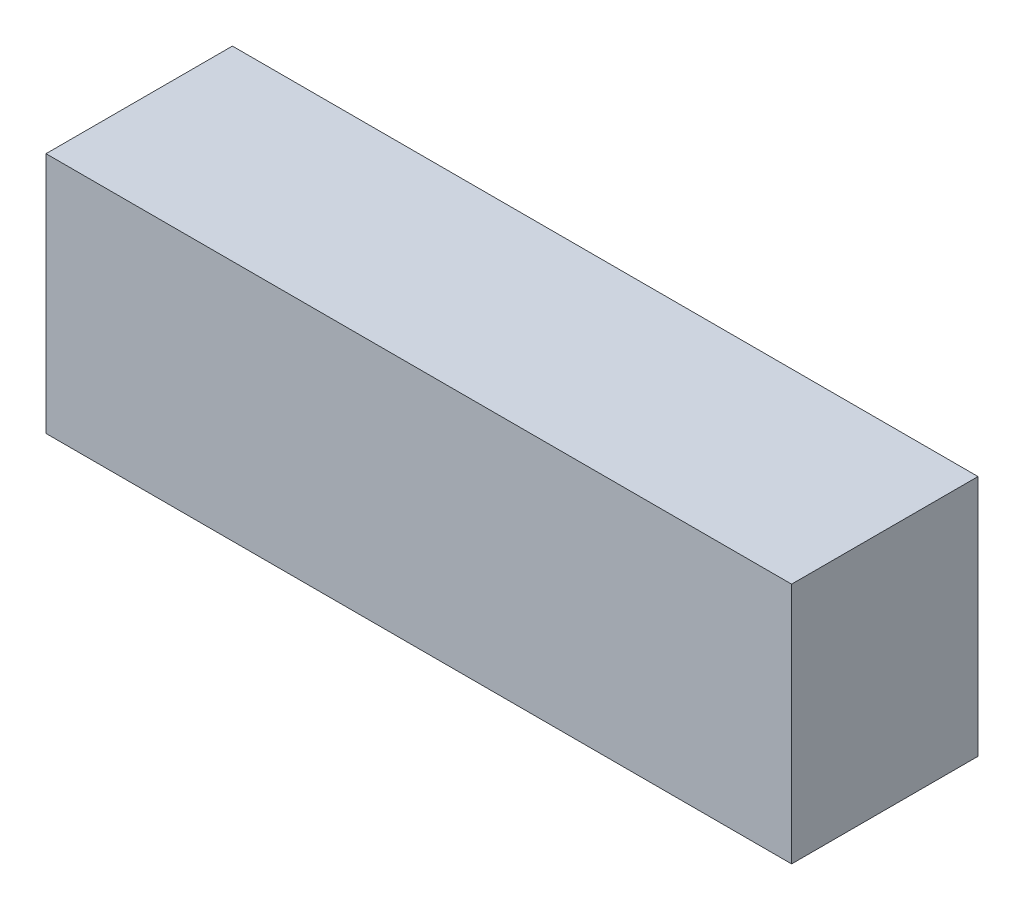
ISO-10303-21;
HEADER;
FILE_DESCRIPTION(('STEP AP214'),'2;1');
FILE_NAME('part.step','',(''),(''),'','','');
FILE_SCHEMA(('AUTOMOTIVE_DESIGN { 1 0 10303 214 1 1 1 1 }'));
ENDSEC;
DATA;
#1=APPLICATION_CONTEXT('core data for automotive mechanical design processes');
#2=APPLICATION_PROTOCOL_DEFINITION('international standard','automotive_design',2000,#1);
#3=PRODUCT_CONTEXT('',#1,'mechanical');
#4=PRODUCT('Part','Part','',(#3));
#5=PRODUCT_RELATED_PRODUCT_CATEGORY('part','',(#4));
#6=PRODUCT_DEFINITION_FORMATION('','',#4);
#7=PRODUCT_DEFINITION_CONTEXT('part definition',#1,'design');
#8=PRODUCT_DEFINITION('design','',#6,#7);
#9=PRODUCT_DEFINITION_SHAPE('','',#8);
#10=(LENGTH_UNIT() NAMED_UNIT(*) SI_UNIT(.MILLI.,.METRE.));
#11=(NAMED_UNIT(*) PLANE_ANGLE_UNIT() SI_UNIT($,.RADIAN.));
#12=(NAMED_UNIT(*) SI_UNIT($,.STERADIAN.) SOLID_ANGLE_UNIT());
#13=UNCERTAINTY_MEASURE_WITH_UNIT(LENGTH_MEASURE(1.E-05),#10,'distance_accuracy_value','');
#14=(GEOMETRIC_REPRESENTATION_CONTEXT(3) GLOBAL_UNCERTAINTY_ASSIGNED_CONTEXT((#13)) GLOBAL_UNIT_ASSIGNED_CONTEXT((#10,
#11,#12)) REPRESENTATION_CONTEXT('',''));
#15=CARTESIAN_POINT('',(0.,0.,0.));
#16=DIRECTION('',(0.,0.,1.));
#17=DIRECTION('',(1.,0.,0.));
#18=AXIS2_PLACEMENT_3D('',#15,#16,#17);
#19=CARTESIAN_POINT('',(0.,0.,-10.));
#20=DIRECTION('',(-1.,0.,0.));
#21=DIRECTION('',(0.,0.,1.));
#22=AXIS2_PLACEMENT_3D('',#19,#20,#21);
#23=PLANE('',#22);
#24=DIRECTION('',(0.,-1.,0.));
#25=VECTOR('',#24,1.);
#26=CARTESIAN_POINT('',(0.,0.,0.));
#27=LINE('',#26,#25);
#28=CARTESIAN_POINT('',(0.,13.,0.));
#29=VERTEX_POINT('',#28);
#30=CARTESIAN_POINT('',(0.,0.,0.));
#31=VERTEX_POINT('',#30);
#32=EDGE_CURVE('E107',#29,#31,#27,.T.);
#33=ORIENTED_EDGE('',*,*,#32,.F.);
#34=DIRECTION('',(0.,0.,1.));
#35=VECTOR('',#34,1.);
#36=CARTESIAN_POINT('',(0.,13.,-10.));
#37=LINE('',#36,#35);
#38=CARTESIAN_POINT('',(0.,13.,-10.));
#39=VERTEX_POINT('',#38);
#40=EDGE_CURVE('E11',#39,#29,#37,.T.);
#41=ORIENTED_EDGE('',*,*,#40,.F.);
#42=DIRECTION('',(0.,-1.,0.));
#43=VECTOR('',#42,1.);
#44=CARTESIAN_POINT('',(0.,0.,-10.));
#45=LINE('',#44,#43);
#46=CARTESIAN_POINT('',(0.,0.,-10.));
#47=VERTEX_POINT('',#46);
#48=EDGE_CURVE('E102',#39,#47,#45,.T.);
#49=ORIENTED_EDGE('',*,*,#48,.T.);
#50=DIRECTION('',(0.,0.,1.));
#51=VECTOR('',#50,1.);
#52=CARTESIAN_POINT('',(0.,0.,-10.));
#53=LINE('',#52,#51);
#54=EDGE_CURVE('E46',#47,#31,#53,.T.);
#55=ORIENTED_EDGE('',*,*,#54,.T.);
#56=EDGE_LOOP('',(#33,#41,#49,#55));
#57=FACE_BOUND('',#56,.T.);
#58=ADVANCED_FACE('F43',(#57),#23,.T.);
#59=CARTESIAN_POINT('',(0.,13.,-10.));
#60=DIRECTION('',(0.,1.,0.));
#61=DIRECTION('',(0.,0.,1.));
#62=AXIS2_PLACEMENT_3D('',#59,#60,#61);
#63=PLANE('',#62);
#64=DIRECTION('',(-1.,0.,0.));
#65=VECTOR('',#64,1.);
#66=CARTESIAN_POINT('',(0.,13.,0.));
#67=LINE('',#66,#65);
#68=CARTESIAN_POINT('',(40.,13.,0.));
#69=VERTEX_POINT('',#68);
#70=EDGE_CURVE('E104',#69,#29,#67,.T.);
#71=ORIENTED_EDGE('',*,*,#70,.F.);
#72=DIRECTION('',(0.,0.,1.));
#73=VECTOR('',#72,1.);
#74=CARTESIAN_POINT('',(40.,13.,-10.));
#75=LINE('',#74,#73);
#76=CARTESIAN_POINT('',(40.,13.,-10.));
#77=VERTEX_POINT('',#76);
#78=EDGE_CURVE('E55',#77,#69,#75,.T.);
#79=ORIENTED_EDGE('',*,*,#78,.F.);
#80=DIRECTION('',(-1.,0.,0.));
#81=VECTOR('',#80,1.);
#82=CARTESIAN_POINT('',(0.,13.,-10.));
#83=LINE('',#82,#81);
#84=EDGE_CURVE('E97',#77,#39,#83,.T.);
#85=ORIENTED_EDGE('',*,*,#84,.T.);
#86=ORIENTED_EDGE('',*,*,#40,.T.);
#87=EDGE_LOOP('',(#71,#79,#85,#86));
#88=FACE_BOUND('',#87,.T.);
#89=ADVANCED_FACE('F117',(#88),#63,.T.);
#90=CARTESIAN_POINT('',(40.,0.,-10.));
#91=DIRECTION('',(1.,0.,0.));
#92=DIRECTION('',(0.,0.,-1.));
#93=AXIS2_PLACEMENT_3D('',#90,#91,#92);
#94=PLANE('',#93);
#95=DIRECTION('',(0.,1.,0.));
#96=VECTOR('',#95,1.);
#97=CARTESIAN_POINT('',(40.,0.,0.));
#98=LINE('',#97,#96);
#99=CARTESIAN_POINT('',(40.,0.,0.));
#100=VERTEX_POINT('',#99);
#101=EDGE_CURVE('E93',#100,#69,#98,.T.);
#102=ORIENTED_EDGE('',*,*,#101,.F.);
#103=DIRECTION('',(0.,0.,1.));
#104=VECTOR('',#103,1.);
#105=CARTESIAN_POINT('',(40.,0.,-10.));
#106=LINE('',#105,#104);
#107=CARTESIAN_POINT('',(40.,0.,-10.));
#108=VERTEX_POINT('',#107);
#109=EDGE_CURVE('E88',#108,#100,#106,.T.);
#110=ORIENTED_EDGE('',*,*,#109,.F.);
#111=DIRECTION('',(0.,1.,0.));
#112=VECTOR('',#111,1.);
#113=CARTESIAN_POINT('',(40.,0.,-10.));
#114=LINE('',#113,#112);
#115=EDGE_CURVE('E91',#108,#77,#114,.T.);
#116=ORIENTED_EDGE('',*,*,#115,.T.);
#117=ORIENTED_EDGE('',*,*,#78,.T.);
#118=EDGE_LOOP('',(#102,#110,#116,#117));
#119=FACE_BOUND('',#118,.T.);
#120=ADVANCED_FACE('F89',(#119),#94,.T.);
#121=CARTESIAN_POINT('',(0.,0.,-10.));
#122=DIRECTION('',(0.,-1.,0.));
#123=DIRECTION('',(0.,0.,-1.));
#124=AXIS2_PLACEMENT_3D('',#121,#122,#123);
#125=PLANE('',#124);
#126=DIRECTION('',(1.,0.,0.));
#127=VECTOR('',#126,1.);
#128=CARTESIAN_POINT('',(0.,0.,0.));
#129=LINE('',#128,#127);
#130=EDGE_CURVE('E110',#31,#100,#129,.T.);
#131=ORIENTED_EDGE('',*,*,#130,.F.);
#132=ORIENTED_EDGE('',*,*,#54,.F.);
#133=DIRECTION('',(1.,0.,0.));
#134=VECTOR('',#133,1.);
#135=CARTESIAN_POINT('',(0.,0.,-10.));
#136=LINE('',#135,#134);
#137=EDGE_CURVE('E100',#47,#108,#136,.T.);
#138=ORIENTED_EDGE('',*,*,#137,.T.);
#139=ORIENTED_EDGE('',*,*,#109,.T.);
#140=EDGE_LOOP('',(#131,#132,#138,#139));
#141=FACE_BOUND('',#140,.T.);
#142=ADVANCED_FACE('F99',(#141),#125,.T.);
#143=CARTESIAN_POINT('',(0.,0.,-10.));
#144=DIRECTION('',(0.,0.,-1.));
#145=DIRECTION('',(-1.,0.,0.));
#146=AXIS2_PLACEMENT_3D('',#143,#144,#145);
#147=PLANE('',#146);
#148=ORIENTED_EDGE('',*,*,#48,.F.);
#149=ORIENTED_EDGE('',*,*,#84,.F.);
#150=ORIENTED_EDGE('',*,*,#115,.F.);
#151=ORIENTED_EDGE('',*,*,#137,.F.);
#152=EDGE_LOOP('',(#148,#149,#150,#151));
#153=FACE_BOUND('',#152,.T.);
#154=ADVANCED_FACE('F96',(#153),#147,.T.);
#155=CARTESIAN_POINT('',(0.,0.,0.));
#156=DIRECTION('',(0.,0.,-1.));
#157=DIRECTION('',(-1.,0.,0.));
#158=AXIS2_PLACEMENT_3D('',#155,#156,#157);
#159=PLANE('',#158);
#160=ORIENTED_EDGE('',*,*,#32,.T.);
#161=ORIENTED_EDGE('',*,*,#130,.T.);
#162=ORIENTED_EDGE('',*,*,#101,.T.);
#163=ORIENTED_EDGE('',*,*,#70,.T.);
#164=EDGE_LOOP('',(#160,#161,#162,#163));
#165=FACE_BOUND('',#164,.T.);
#166=ADVANCED_FACE('F116',(#165),#159,.F.);
#167=CLOSED_SHELL('',(#58,#89,#120,#142,#154,#166));
#168=MANIFOLD_SOLID_BREP('B2',#167);
#169=ADVANCED_BREP_SHAPE_REPRESENTATION('',(#18,#168),#14);
#170=SHAPE_DEFINITION_REPRESENTATION(#9,#169);
ENDSEC;
END-ISO-10303-21;
